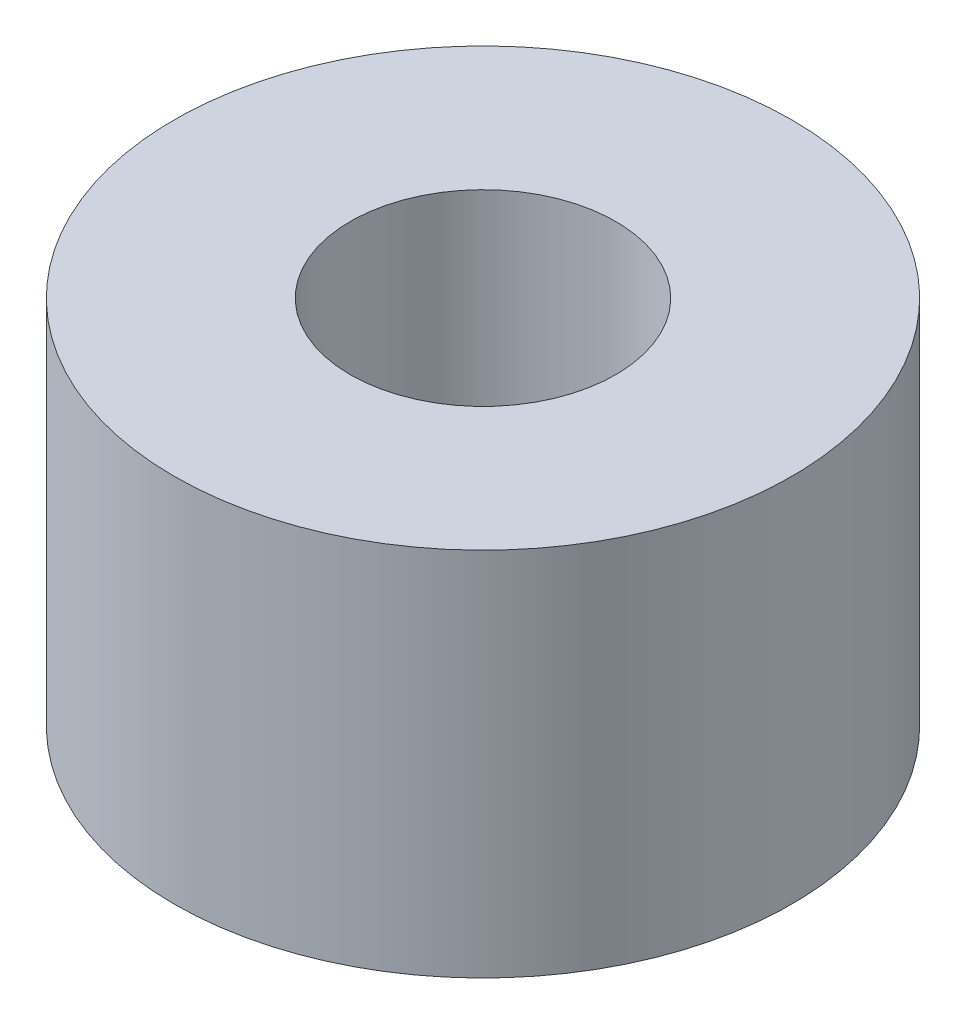
ISO-10303-21;
HEADER;
FILE_DESCRIPTION(('STEP AP214'),'2;1');
FILE_NAME('part.step','',(''),(''),'','','');
FILE_SCHEMA(('AUTOMOTIVE_DESIGN { 1 0 10303 214 1 1 1 1 }'));
ENDSEC;
DATA;
#1=APPLICATION_CONTEXT('core data for automotive mechanical design processes');
#2=APPLICATION_PROTOCOL_DEFINITION('international standard','automotive_design',2000,#1);
#3=PRODUCT_CONTEXT('',#1,'mechanical');
#4=PRODUCT('Part','Part','',(#3));
#5=PRODUCT_RELATED_PRODUCT_CATEGORY('part','',(#4));
#6=PRODUCT_DEFINITION_FORMATION('','',#4);
#7=PRODUCT_DEFINITION_CONTEXT('part definition',#1,'design');
#8=PRODUCT_DEFINITION('design','',#6,#7);
#9=PRODUCT_DEFINITION_SHAPE('','',#8);
#10=(LENGTH_UNIT() NAMED_UNIT(*) SI_UNIT(.MILLI.,.METRE.));
#11=(NAMED_UNIT(*) PLANE_ANGLE_UNIT() SI_UNIT($,.RADIAN.));
#12=(NAMED_UNIT(*) SI_UNIT($,.STERADIAN.) SOLID_ANGLE_UNIT());
#13=UNCERTAINTY_MEASURE_WITH_UNIT(LENGTH_MEASURE(1.E-05),#10,'distance_accuracy_value','');
#14=(GEOMETRIC_REPRESENTATION_CONTEXT(3) GLOBAL_UNCERTAINTY_ASSIGNED_CONTEXT((#13)) GLOBAL_UNIT_ASSIGNED_CONTEXT((#10,
#11,#12)) REPRESENTATION_CONTEXT('',''));
#15=CARTESIAN_POINT('',(0.,0.,0.));
#16=DIRECTION('',(0.,0.,1.));
#17=DIRECTION('',(1.,0.,0.));
#18=AXIS2_PLACEMENT_3D('',#15,#16,#17);
#19=CARTESIAN_POINT('',(0.,0.,0.));
#20=DIRECTION('',(0.,-1.,0.));
#21=DIRECTION('',(0.,0.,-1.));
#22=AXIS2_PLACEMENT_3D('',#19,#20,#21);
#23=PLANE('',#22);
#24=CARTESIAN_POINT('',(0.,0.,0.));
#25=DIRECTION('',(0.,1.,0.));
#26=DIRECTION('',(0.,0.,1.));
#27=AXIS2_PLACEMENT_3D('',#24,#25,#26);
#28=CIRCLE('',#27,4.3);
#29=CARTESIAN_POINT('',(0.,0.,4.3));
#30=VERTEX_POINT('',#29);
#31=EDGE_CURVE('E47',#30,#30,#28,.T.);
#32=ORIENTED_EDGE('',*,*,#31,.T.);
#33=EDGE_LOOP('',(#32));
#34=FACE_BOUND('',#33,.T.);
#35=CARTESIAN_POINT('',(0.,0.,0.));
#36=DIRECTION('',(0.,-1.,0.));
#37=DIRECTION('',(0.,0.,-1.));
#38=AXIS2_PLACEMENT_3D('',#35,#36,#37);
#39=CIRCLE('',#38,10.);
#40=CARTESIAN_POINT('',(0.,0.,-10.));
#41=VERTEX_POINT('',#40);
#42=EDGE_CURVE('E10',#41,#41,#39,.T.);
#43=ORIENTED_EDGE('',*,*,#42,.T.);
#44=EDGE_LOOP('',(#43));
#45=FACE_BOUND('',#44,.T.);
#46=ADVANCED_FACE('F37',(#34,#45),#23,.T.);
#47=CARTESIAN_POINT('',(0.,0.,0.));
#48=DIRECTION('',(0.,-1.,0.));
#49=DIRECTION('',(0.,0.,-1.));
#50=AXIS2_PLACEMENT_3D('',#47,#48,#49);
#51=CYLINDRICAL_SURFACE('',#50,10.);
#52=CARTESIAN_POINT('',(0.,12.,0.));
#53=DIRECTION('',(0.,-1.,0.));
#54=DIRECTION('',(0.,0.,-1.));
#55=AXIS2_PLACEMENT_3D('',#52,#53,#54);
#56=CIRCLE('',#55,10.);
#57=CARTESIAN_POINT('',(0.,12.,-10.));
#58=VERTEX_POINT('',#57);
#59=EDGE_CURVE('E43',#58,#58,#56,.T.);
#60=ORIENTED_EDGE('',*,*,#59,.T.);
#61=EDGE_LOOP('',(#60));
#62=FACE_BOUND('',#61,.T.);
#63=ORIENTED_EDGE('',*,*,#42,.F.);
#64=EDGE_LOOP('',(#63));
#65=FACE_BOUND('',#64,.T.);
#66=ADVANCED_FACE('F62',(#62,#65),#51,.T.);
#67=CARTESIAN_POINT('',(10.,12.,0.));
#68=DIRECTION('',(0.,1.,0.));
#69=DIRECTION('',(0.,0.,1.));
#70=AXIS2_PLACEMENT_3D('',#67,#68,#69);
#71=PLANE('',#70);
#72=CARTESIAN_POINT('',(0.,12.,0.));
#73=DIRECTION('',(0.,1.,0.));
#74=DIRECTION('',(0.,0.,1.));
#75=AXIS2_PLACEMENT_3D('',#72,#73,#74);
#76=CIRCLE('',#75,4.3);
#77=CARTESIAN_POINT('',(0.,12.,4.3));
#78=VERTEX_POINT('',#77);
#79=EDGE_CURVE('E51',#78,#78,#76,.T.);
#80=ORIENTED_EDGE('',*,*,#79,.F.);
#81=EDGE_LOOP('',(#80));
#82=FACE_BOUND('',#81,.T.);
#83=ORIENTED_EDGE('',*,*,#59,.F.);
#84=EDGE_LOOP('',(#83));
#85=FACE_BOUND('',#84,.T.);
#86=ADVANCED_FACE('F59',(#82,#85),#71,.T.);
#87=CARTESIAN_POINT('',(0.,0.,0.));
#88=DIRECTION('',(0.,1.,0.));
#89=DIRECTION('',(0.,0.,1.));
#90=AXIS2_PLACEMENT_3D('',#87,#88,#89);
#91=CYLINDRICAL_SURFACE('',#90,4.3);
#92=ORIENTED_EDGE('',*,*,#31,.F.);
#93=EDGE_LOOP('',(#92));
#94=FACE_BOUND('',#93,.T.);
#95=ORIENTED_EDGE('',*,*,#79,.T.);
#96=EDGE_LOOP('',(#95));
#97=FACE_BOUND('',#96,.T.);
#98=ADVANCED_FACE('F57',(#94,#97),#91,.F.);
#99=CLOSED_SHELL('',(#46,#66,#86,#98));
#100=MANIFOLD_SOLID_BREP('B2',#99);
#101=ADVANCED_BREP_SHAPE_REPRESENTATION('',(#18,#100),#14);
#102=SHAPE_DEFINITION_REPRESENTATION(#9,#101);
ENDSEC;
END-ISO-10303-21;
